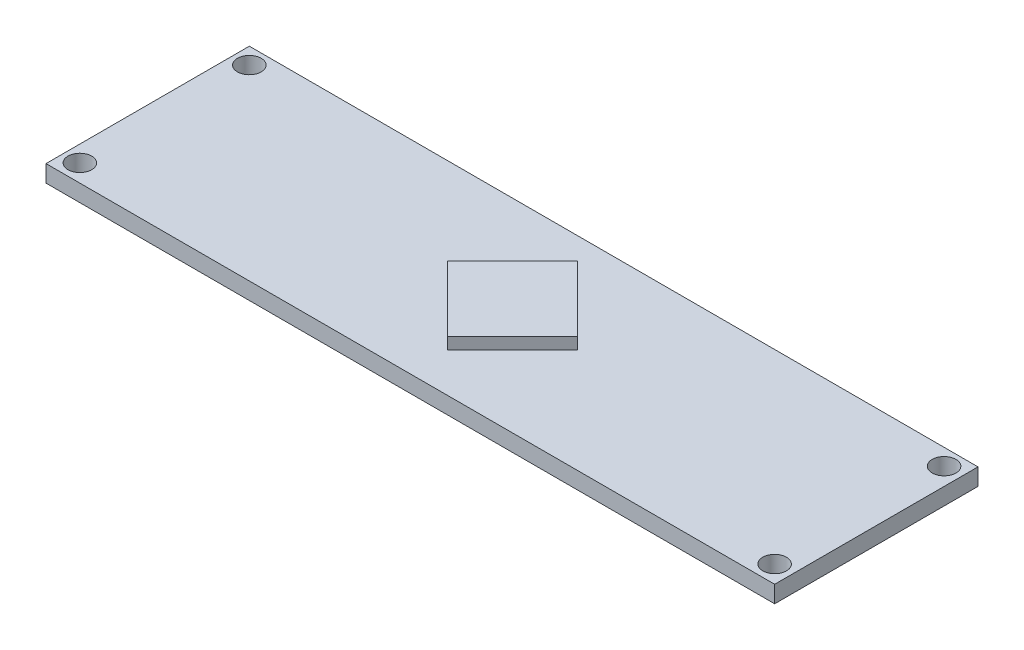
ISO-10303-21;
HEADER;
FILE_DESCRIPTION(('STEP AP214'),'2;1');
FILE_NAME('part.step','',(''),(''),'','','');
FILE_SCHEMA(('AUTOMOTIVE_DESIGN { 1 0 10303 214 1 1 1 1 }'));
ENDSEC;
DATA;
#1=APPLICATION_CONTEXT('core data for automotive mechanical design processes');
#2=APPLICATION_PROTOCOL_DEFINITION('international standard','automotive_design',2000,#1);
#3=PRODUCT_CONTEXT('',#1,'mechanical');
#4=PRODUCT('Part','Part','',(#3));
#5=PRODUCT_RELATED_PRODUCT_CATEGORY('part','',(#4));
#6=PRODUCT_DEFINITION_FORMATION('','',#4);
#7=PRODUCT_DEFINITION_CONTEXT('part definition',#1,'design');
#8=PRODUCT_DEFINITION('design','',#6,#7);
#9=PRODUCT_DEFINITION_SHAPE('','',#8);
#10=(LENGTH_UNIT() NAMED_UNIT(*) SI_UNIT(.MILLI.,.METRE.));
#11=(NAMED_UNIT(*) PLANE_ANGLE_UNIT() SI_UNIT($,.RADIAN.));
#12=(NAMED_UNIT(*) SI_UNIT($,.STERADIAN.) SOLID_ANGLE_UNIT());
#13=UNCERTAINTY_MEASURE_WITH_UNIT(LENGTH_MEASURE(1.E-05),#10,'distance_accuracy_value','');
#14=(GEOMETRIC_REPRESENTATION_CONTEXT(3) GLOBAL_UNCERTAINTY_ASSIGNED_CONTEXT((#13)) GLOBAL_UNIT_ASSIGNED_CONTEXT((#10,
#11,#12)) REPRESENTATION_CONTEXT('',''));
#15=CARTESIAN_POINT('',(0.,0.,0.));
#16=DIRECTION('',(0.,0.,1.));
#17=DIRECTION('',(1.,0.,0.));
#18=AXIS2_PLACEMENT_3D('',#15,#16,#17);
#19=CARTESIAN_POINT('',(0.,1.,0.));
#20=DIRECTION('',(0.,1.,0.));
#21=DIRECTION('',(0.,0.,1.));
#22=AXIS2_PLACEMENT_3D('',#19,#20,#21);
#23=PLANE('',#22);
#24=CARTESIAN_POINT('',(-20.5344248327645,1.,-5.03297406386491));
#25=DIRECTION('',(0.,1.,0.));
#26=DIRECTION('',(0.,0.,1.));
#27=AXIS2_PLACEMENT_3D('',#24,#25,#26);
#28=CIRCLE('',#27,0.699999999999998);
#29=CARTESIAN_POINT('',(-20.5344248327645,1.,-4.33297406386491));
#30=VERTEX_POINT('',#29);
#31=EDGE_CURVE('E135',#30,#30,#28,.T.);
#32=ORIENTED_EDGE('',*,*,#31,.F.);
#33=EDGE_LOOP('',(#32));
#34=FACE_BOUND('',#33,.T.);
#35=CARTESIAN_POINT('',(20.4655751672355,1.,4.96702593613509));
#36=DIRECTION('',(0.,1.,0.));
#37=DIRECTION('',(0.,0.,1.));
#38=AXIS2_PLACEMENT_3D('',#35,#36,#37);
#39=CIRCLE('',#38,0.699999999999998);
#40=CARTESIAN_POINT('',(20.4655751672355,1.,5.66702593613509));
#41=VERTEX_POINT('',#40);
#42=EDGE_CURVE('E149',#41,#41,#39,.T.);
#43=ORIENTED_EDGE('',*,*,#42,.F.);
#44=EDGE_LOOP('',(#43));
#45=FACE_BOUND('',#44,.T.);
#46=DIRECTION('',(0.,0.,1.));
#47=VECTOR('',#46,1.);
#48=CARTESIAN_POINT('',(-21.5,1.,-6.));
#49=LINE('',#48,#47);
#50=CARTESIAN_POINT('',(-21.5,1.,-6.));
#51=VERTEX_POINT('',#50);
#52=CARTESIAN_POINT('',(-21.5,1.,6.));
#53=VERTEX_POINT('',#52);
#54=EDGE_CURVE('E161',#51,#53,#49,.T.);
#55=ORIENTED_EDGE('',*,*,#54,.T.);
#56=DIRECTION('',(1.,0.,0.));
#57=VECTOR('',#56,1.);
#58=CARTESIAN_POINT('',(-21.5,1.,6.));
#59=LINE('',#58,#57);
#60=CARTESIAN_POINT('',(21.5,1.,5.99999999999999));
#61=VERTEX_POINT('',#60);
#62=EDGE_CURVE('E85',#53,#61,#59,.T.);
#63=ORIENTED_EDGE('',*,*,#62,.T.);
#64=DIRECTION('',(0.,0.,-1.));
#65=VECTOR('',#64,1.);
#66=CARTESIAN_POINT('',(21.5,1.,-6.00000000000001));
#67=LINE('',#66,#65);
#68=CARTESIAN_POINT('',(21.5,1.,-6.00000000000001));
#69=VERTEX_POINT('',#68);
#70=EDGE_CURVE('E164',#61,#69,#67,.T.);
#71=ORIENTED_EDGE('',*,*,#70,.T.);
#72=DIRECTION('',(-1.,0.,0.));
#73=VECTOR('',#72,1.);
#74=CARTESIAN_POINT('',(-21.5,1.,-6.));
#75=LINE('',#74,#73);
#76=EDGE_CURVE('E57',#69,#51,#75,.T.);
#77=ORIENTED_EDGE('',*,*,#76,.T.);
#78=EDGE_LOOP('',(#55,#63,#71,#77));
#79=FACE_BOUND('',#78,.T.);
#80=CARTESIAN_POINT('',(-20.5344248327645,1.,4.96702593613509));
#81=DIRECTION('',(0.,1.,0.));
#82=DIRECTION('',(0.,0.,1.));
#83=AXIS2_PLACEMENT_3D('',#80,#81,#82);
#84=CIRCLE('',#83,0.699999999999998);
#85=CARTESIAN_POINT('',(-20.5344248327645,1.,5.66702593613509));
#86=VERTEX_POINT('',#85);
#87=EDGE_CURVE('E155',#86,#86,#84,.T.);
#88=ORIENTED_EDGE('',*,*,#87,.F.);
#89=EDGE_LOOP('',(#88));
#90=FACE_BOUND('',#89,.T.);
#91=CARTESIAN_POINT('',(20.4655751672355,1.,-5.03297406386491));
#92=DIRECTION('',(0.,1.,0.));
#93=DIRECTION('',(0.,0.,1.));
#94=AXIS2_PLACEMENT_3D('',#91,#92,#93);
#95=CIRCLE('',#94,0.699999999999998);
#96=CARTESIAN_POINT('',(20.4655751672355,1.,-4.33297406386491));
#97=VERTEX_POINT('',#96);
#98=EDGE_CURVE('E143',#97,#97,#95,.T.);
#99=ORIENTED_EDGE('',*,*,#98,.F.);
#100=EDGE_LOOP('',(#99));
#101=FACE_BOUND('',#100,.T.);
#102=DIRECTION('',(0.707106781186546,0.,-0.707106781186549));
#103=VECTOR('',#102,1.);
#104=CARTESIAN_POINT('',(-0.13137989327656,1.,3.68965388034485));
#105=LINE('',#104,#103);
#106=CARTESIAN_POINT('',(-0.13137989327656,1.,3.68965388034485));
#107=VERTEX_POINT('',#106);
#108=CARTESIAN_POINT('',(3.718167830219,1.,-0.159893843150725));
#109=VERTEX_POINT('',#108);
#110=EDGE_CURVE('E332',#107,#109,#105,.T.);
#111=ORIENTED_EDGE('',*,*,#110,.F.);
#112=DIRECTION('',(0.707106781186549,0.,0.707106781186546));
#113=VECTOR('',#112,1.);
#114=CARTESIAN_POINT('',(-3.98092761677213,1.,-0.159893843150713));
#115=LINE('',#114,#113);
#116=CARTESIAN_POINT('',(-3.98092761677213,1.,-0.159893843150713));
#117=VERTEX_POINT('',#116);
#118=EDGE_CURVE('E130',#117,#107,#115,.T.);
#119=ORIENTED_EDGE('',*,*,#118,.F.);
#120=DIRECTION('',(-0.707106781186546,0.,0.707106781186549));
#121=VECTOR('',#120,1.);
#122=CARTESIAN_POINT('',(-3.98092761677213,1.,-0.159893843150713));
#123=LINE('',#122,#121);
#124=CARTESIAN_POINT('',(-0.131379893276574,1.,-4.00944156664628));
#125=VERTEX_POINT('',#124);
#126=EDGE_CURVE('E126',#125,#117,#123,.T.);
#127=ORIENTED_EDGE('',*,*,#126,.F.);
#128=DIRECTION('',(-0.707106781186549,0.,-0.707106781186546));
#129=VECTOR('',#128,1.);
#130=CARTESIAN_POINT('',(-0.131379893276574,1.,-4.00944156664629));
#131=LINE('',#130,#129);
#132=EDGE_CURVE('E329',#109,#125,#131,.T.);
#133=ORIENTED_EDGE('',*,*,#132,.F.);
#134=EDGE_LOOP('',(#111,#119,#127,#133));
#135=FACE_BOUND('',#134,.T.);
#136=ADVANCED_FACE('F33',(#34,#45,#79,#90,#101,#135),#23,.T.);
#137=CARTESIAN_POINT('',(0.,0.,0.));
#138=DIRECTION('',(0.,1.,0.));
#139=DIRECTION('',(0.,0.,1.));
#140=AXIS2_PLACEMENT_3D('',#137,#138,#139);
#141=PLANE('',#140);
#142=CARTESIAN_POINT('',(20.4655751672355,0.,-5.03297406386491));
#143=DIRECTION('',(0.,1.,0.));
#144=DIRECTION('',(0.,0.,1.));
#145=AXIS2_PLACEMENT_3D('',#142,#143,#144);
#146=CIRCLE('',#145,0.699999999999998);
#147=CARTESIAN_POINT('',(20.4655751672355,0.,-4.33297406386491));
#148=VERTEX_POINT('',#147);
#149=EDGE_CURVE('E141',#148,#148,#146,.T.);
#150=ORIENTED_EDGE('',*,*,#149,.T.);
#151=EDGE_LOOP('',(#150));
#152=FACE_BOUND('',#151,.T.);
#153=CARTESIAN_POINT('',(-20.5344248327645,0.,4.96702593613509));
#154=DIRECTION('',(0.,1.,0.));
#155=DIRECTION('',(0.,0.,1.));
#156=AXIS2_PLACEMENT_3D('',#153,#154,#155);
#157=CIRCLE('',#156,0.699999999999998);
#158=CARTESIAN_POINT('',(-20.5344248327645,0.,5.66702593613509));
#159=VERTEX_POINT('',#158);
#160=EDGE_CURVE('E152',#159,#159,#157,.T.);
#161=ORIENTED_EDGE('',*,*,#160,.T.);
#162=EDGE_LOOP('',(#161));
#163=FACE_BOUND('',#162,.T.);
#164=DIRECTION('',(0.,0.,1.));
#165=VECTOR('',#164,1.);
#166=CARTESIAN_POINT('',(-21.5,0.,-6.));
#167=LINE('',#166,#165);
#168=CARTESIAN_POINT('',(-21.5,0.,-6.));
#169=VERTEX_POINT('',#168);
#170=CARTESIAN_POINT('',(-21.5,0.,6.));
#171=VERTEX_POINT('',#170);
#172=EDGE_CURVE('E158',#169,#171,#167,.T.);
#173=ORIENTED_EDGE('',*,*,#172,.F.);
#174=DIRECTION('',(-1.,0.,0.));
#175=VECTOR('',#174,1.);
#176=CARTESIAN_POINT('',(-21.5,0.,-6.));
#177=LINE('',#176,#175);
#178=CARTESIAN_POINT('',(21.5,0.,-6.00000000000001));
#179=VERTEX_POINT('',#178);
#180=EDGE_CURVE('E78',#179,#169,#177,.T.);
#181=ORIENTED_EDGE('',*,*,#180,.F.);
#182=DIRECTION('',(0.,0.,-1.));
#183=VECTOR('',#182,1.);
#184=CARTESIAN_POINT('',(21.5,0.,-6.00000000000001));
#185=LINE('',#184,#183);
#186=CARTESIAN_POINT('',(21.5,0.,5.99999999999999));
#187=VERTEX_POINT('',#186);
#188=EDGE_CURVE('E172',#187,#179,#185,.T.);
#189=ORIENTED_EDGE('',*,*,#188,.F.);
#190=DIRECTION('',(1.,0.,0.));
#191=VECTOR('',#190,1.);
#192=CARTESIAN_POINT('',(-21.5,0.,6.));
#193=LINE('',#192,#191);
#194=EDGE_CURVE('E170',#171,#187,#193,.T.);
#195=ORIENTED_EDGE('',*,*,#194,.F.);
#196=EDGE_LOOP('',(#173,#181,#189,#195));
#197=FACE_BOUND('',#196,.T.);
#198=CARTESIAN_POINT('',(20.4655751672355,0.,4.96702593613509));
#199=DIRECTION('',(0.,1.,0.));
#200=DIRECTION('',(0.,0.,1.));
#201=AXIS2_PLACEMENT_3D('',#198,#199,#200);
#202=CIRCLE('',#201,0.699999999999998);
#203=CARTESIAN_POINT('',(20.4655751672355,0.,5.66702593613509));
#204=VERTEX_POINT('',#203);
#205=EDGE_CURVE('E146',#204,#204,#202,.T.);
#206=ORIENTED_EDGE('',*,*,#205,.T.);
#207=EDGE_LOOP('',(#206));
#208=FACE_BOUND('',#207,.T.);
#209=CARTESIAN_POINT('',(-20.5344248327645,0.,-5.03297406386491));
#210=DIRECTION('',(0.,1.,0.));
#211=DIRECTION('',(0.,0.,1.));
#212=AXIS2_PLACEMENT_3D('',#209,#210,#211);
#213=CIRCLE('',#212,0.699999999999998);
#214=CARTESIAN_POINT('',(-20.5344248327645,0.,-4.33297406386491));
#215=VERTEX_POINT('',#214);
#216=EDGE_CURVE('E132',#215,#215,#213,.T.);
#217=ORIENTED_EDGE('',*,*,#216,.T.);
#218=EDGE_LOOP('',(#217));
#219=FACE_BOUND('',#218,.T.);
#220=ADVANCED_FACE('F185',(#152,#163,#197,#208,#219),#141,.F.);
#221=CARTESIAN_POINT('',(-21.5,1.,-6.));
#222=DIRECTION('',(1.,0.,0.));
#223=DIRECTION('',(0.,0.,-1.));
#224=AXIS2_PLACEMENT_3D('',#221,#222,#223);
#225=PLANE('',#224);
#226=ORIENTED_EDGE('',*,*,#172,.T.);
#227=DIRECTION('',(0.,-1.,0.));
#228=VECTOR('',#227,1.);
#229=CARTESIAN_POINT('',(-21.5,1.,6.));
#230=LINE('',#229,#228);
#231=EDGE_CURVE('E11',#53,#171,#230,.T.);
#232=ORIENTED_EDGE('',*,*,#231,.F.);
#233=ORIENTED_EDGE('',*,*,#54,.F.);
#234=DIRECTION('',(0.,-1.,0.));
#235=VECTOR('',#234,1.);
#236=CARTESIAN_POINT('',(-21.5,1.,-6.));
#237=LINE('',#236,#235);
#238=EDGE_CURVE('E167',#51,#169,#237,.T.);
#239=ORIENTED_EDGE('',*,*,#238,.T.);
#240=EDGE_LOOP('',(#226,#232,#233,#239));
#241=FACE_BOUND('',#240,.T.);
#242=ADVANCED_FACE('F35',(#241),#225,.F.);
#243=CARTESIAN_POINT('',(-21.5,1.,6.));
#244=DIRECTION('',(0.,0.,-1.));
#245=DIRECTION('',(-1.,0.,0.));
#246=AXIS2_PLACEMENT_3D('',#243,#244,#245);
#247=PLANE('',#246);
#248=ORIENTED_EDGE('',*,*,#194,.T.);
#249=DIRECTION('',(0.,-1.,0.));
#250=VECTOR('',#249,1.);
#251=CARTESIAN_POINT('',(21.5,1.,5.99999999999999));
#252=LINE('',#251,#250);
#253=EDGE_CURVE('E41',#61,#187,#252,.T.);
#254=ORIENTED_EDGE('',*,*,#253,.F.);
#255=ORIENTED_EDGE('',*,*,#62,.F.);
#256=ORIENTED_EDGE('',*,*,#231,.T.);
#257=EDGE_LOOP('',(#248,#254,#255,#256));
#258=FACE_BOUND('',#257,.T.);
#259=ADVANCED_FACE('F201',(#258),#247,.F.);
#260=CARTESIAN_POINT('',(21.5,1.,-6.00000000000001));
#261=DIRECTION('',(-1.,0.,0.));
#262=DIRECTION('',(0.,0.,1.));
#263=AXIS2_PLACEMENT_3D('',#260,#261,#262);
#264=PLANE('',#263);
#265=ORIENTED_EDGE('',*,*,#188,.T.);
#266=DIRECTION('',(0.,-1.,0.));
#267=VECTOR('',#266,1.);
#268=CARTESIAN_POINT('',(21.5,1.,-6.00000000000001));
#269=LINE('',#268,#267);
#270=EDGE_CURVE('E176',#69,#179,#269,.T.);
#271=ORIENTED_EDGE('',*,*,#270,.F.);
#272=ORIENTED_EDGE('',*,*,#70,.F.);
#273=ORIENTED_EDGE('',*,*,#253,.T.);
#274=EDGE_LOOP('',(#265,#271,#272,#273));
#275=FACE_BOUND('',#274,.T.);
#276=ADVANCED_FACE('F181',(#275),#264,.F.);
#277=CARTESIAN_POINT('',(-21.5,1.,-6.));
#278=DIRECTION('',(0.,0.,1.));
#279=DIRECTION('',(1.,0.,0.));
#280=AXIS2_PLACEMENT_3D('',#277,#278,#279);
#281=PLANE('',#280);
#282=ORIENTED_EDGE('',*,*,#180,.T.);
#283=ORIENTED_EDGE('',*,*,#238,.F.);
#284=ORIENTED_EDGE('',*,*,#76,.F.);
#285=ORIENTED_EDGE('',*,*,#270,.T.);
#286=EDGE_LOOP('',(#282,#283,#284,#285));
#287=FACE_BOUND('',#286,.T.);
#288=ADVANCED_FACE('F190',(#287),#281,.F.);
#289=CARTESIAN_POINT('',(-20.5344248327645,1.,4.96702593613509));
#290=DIRECTION('',(0.,-1.,0.));
#291=DIRECTION('',(0.,0.,-1.));
#292=AXIS2_PLACEMENT_3D('',#289,#290,#291);
#293=CYLINDRICAL_SURFACE('',#292,0.699999999999998);
#294=ORIENTED_EDGE('',*,*,#87,.T.);
#295=EDGE_LOOP('',(#294));
#296=FACE_BOUND('',#295,.T.);
#297=ORIENTED_EDGE('',*,*,#160,.F.);
#298=EDGE_LOOP('',(#297));
#299=FACE_BOUND('',#298,.T.);
#300=ADVANCED_FACE('F192',(#296,#299),#293,.F.);
#301=CARTESIAN_POINT('',(20.4655751672355,1.,4.96702593613509));
#302=DIRECTION('',(0.,-1.,0.));
#303=DIRECTION('',(0.,0.,-1.));
#304=AXIS2_PLACEMENT_3D('',#301,#302,#303);
#305=CYLINDRICAL_SURFACE('',#304,0.699999999999998);
#306=ORIENTED_EDGE('',*,*,#42,.T.);
#307=EDGE_LOOP('',(#306));
#308=FACE_BOUND('',#307,.T.);
#309=ORIENTED_EDGE('',*,*,#205,.F.);
#310=EDGE_LOOP('',(#309));
#311=FACE_BOUND('',#310,.T.);
#312=ADVANCED_FACE('F198',(#308,#311),#305,.F.);
#313=CARTESIAN_POINT('',(20.4655751672355,1.,-5.03297406386491));
#314=DIRECTION('',(0.,-1.,0.));
#315=DIRECTION('',(0.,0.,-1.));
#316=AXIS2_PLACEMENT_3D('',#313,#314,#315);
#317=CYLINDRICAL_SURFACE('',#316,0.699999999999998);
#318=ORIENTED_EDGE('',*,*,#98,.T.);
#319=EDGE_LOOP('',(#318));
#320=FACE_BOUND('',#319,.T.);
#321=ORIENTED_EDGE('',*,*,#149,.F.);
#322=EDGE_LOOP('',(#321));
#323=FACE_BOUND('',#322,.T.);
#324=ADVANCED_FACE('F218',(#320,#323),#317,.F.);
#325=CARTESIAN_POINT('',(-20.5344248327645,1.,-5.03297406386491));
#326=DIRECTION('',(0.,-1.,0.));
#327=DIRECTION('',(0.,0.,-1.));
#328=AXIS2_PLACEMENT_3D('',#325,#326,#327);
#329=CYLINDRICAL_SURFACE('',#328,0.699999999999998);
#330=ORIENTED_EDGE('',*,*,#31,.T.);
#331=EDGE_LOOP('',(#330));
#332=FACE_BOUND('',#331,.T.);
#333=ORIENTED_EDGE('',*,*,#216,.F.);
#334=EDGE_LOOP('',(#333));
#335=FACE_BOUND('',#334,.T.);
#336=ADVANCED_FACE('F222',(#332,#335),#329,.F.);
#337=CARTESIAN_POINT('',(-3.98092761677213,1.7,-0.159893843150713));
#338=DIRECTION('',(0.707106781186546,0.,-0.707106781186549));
#339=DIRECTION('',(-0.707106781186549,0.,-0.707106781186546));
#340=AXIS2_PLACEMENT_3D('',#337,#338,#339);
#341=PLANE('',#340);
#342=ORIENTED_EDGE('',*,*,#118,.T.);
#343=DIRECTION('',(0.,-1.,0.));
#344=VECTOR('',#343,1.);
#345=CARTESIAN_POINT('',(-0.13137989327656,1.7,3.68965388034485));
#346=LINE('',#345,#344);
#347=CARTESIAN_POINT('',(-0.13137989327656,1.7,3.68965388034485));
#348=VERTEX_POINT('',#347);
#349=EDGE_CURVE('E111',#348,#107,#346,.T.);
#350=ORIENTED_EDGE('',*,*,#349,.F.);
#351=DIRECTION('',(0.707106781186549,0.,0.707106781186546));
#352=VECTOR('',#351,1.);
#353=CARTESIAN_POINT('',(-3.98092761677213,1.7,-0.159893843150713));
#354=LINE('',#353,#352);
#355=CARTESIAN_POINT('',(-3.98092761677213,1.7,-0.159893843150713));
#356=VERTEX_POINT('',#355);
#357=EDGE_CURVE('E118',#356,#348,#354,.T.);
#358=ORIENTED_EDGE('',*,*,#357,.F.);
#359=DIRECTION('',(0.,-1.,0.));
#360=VECTOR('',#359,1.);
#361=CARTESIAN_POINT('',(-3.98092761677213,1.7,-0.159893843150713));
#362=LINE('',#361,#360);
#363=EDGE_CURVE('E326',#356,#117,#362,.T.);
#364=ORIENTED_EDGE('',*,*,#363,.T.);
#365=EDGE_LOOP('',(#342,#350,#358,#364));
#366=FACE_BOUND('',#365,.T.);
#367=ADVANCED_FACE('F128',(#366),#341,.F.);
#368=CARTESIAN_POINT('',(-0.13137989327656,1.7,3.68965388034485));
#369=DIRECTION('',(-0.707106781186549,0.,-0.707106781186546));
#370=DIRECTION('',(-0.707106781186546,0.,0.707106781186549));
#371=AXIS2_PLACEMENT_3D('',#368,#369,#370);
#372=PLANE('',#371);
#373=ORIENTED_EDGE('',*,*,#110,.T.);
#374=DIRECTION('',(0.,-1.,0.));
#375=VECTOR('',#374,1.);
#376=CARTESIAN_POINT('',(3.718167830219,1.7,-0.159893843150725));
#377=LINE('',#376,#375);
#378=CARTESIAN_POINT('',(3.718167830219,1.7,-0.159893843150725));
#379=VERTEX_POINT('',#378);
#380=EDGE_CURVE('E114',#379,#109,#377,.T.);
#381=ORIENTED_EDGE('',*,*,#380,.F.);
#382=DIRECTION('',(0.707106781186546,0.,-0.707106781186549));
#383=VECTOR('',#382,1.);
#384=CARTESIAN_POINT('',(-0.13137989327656,1.7,3.68965388034485));
#385=LINE('',#384,#383);
#386=EDGE_CURVE('E107',#348,#379,#385,.T.);
#387=ORIENTED_EDGE('',*,*,#386,.F.);
#388=ORIENTED_EDGE('',*,*,#349,.T.);
#389=EDGE_LOOP('',(#373,#381,#387,#388));
#390=FACE_BOUND('',#389,.T.);
#391=ADVANCED_FACE('F109',(#390),#372,.F.);
#392=CARTESIAN_POINT('',(-0.131379893276574,1.7,-4.00944156664629));
#393=DIRECTION('',(-0.707106781186546,0.,0.707106781186549));
#394=DIRECTION('',(0.707106781186549,0.,0.707106781186546));
#395=AXIS2_PLACEMENT_3D('',#392,#393,#394);
#396=PLANE('',#395);
#397=ORIENTED_EDGE('',*,*,#132,.T.);
#398=DIRECTION('',(0.,-1.,0.));
#399=VECTOR('',#398,1.);
#400=CARTESIAN_POINT('',(-0.131379893276574,1.7,-4.00944156664629));
#401=LINE('',#400,#399);
#402=CARTESIAN_POINT('',(-0.131379893276574,1.7,-4.00944156664629));
#403=VERTEX_POINT('',#402);
#404=EDGE_CURVE('E48',#403,#125,#401,.T.);
#405=ORIENTED_EDGE('',*,*,#404,.F.);
#406=DIRECTION('',(-0.707106781186549,0.,-0.707106781186546));
#407=VECTOR('',#406,1.);
#408=CARTESIAN_POINT('',(-0.131379893276574,1.7,-4.00944156664629));
#409=LINE('',#408,#407);
#410=EDGE_CURVE('E117',#379,#403,#409,.T.);
#411=ORIENTED_EDGE('',*,*,#410,.F.);
#412=ORIENTED_EDGE('',*,*,#380,.T.);
#413=EDGE_LOOP('',(#397,#405,#411,#412));
#414=FACE_BOUND('',#413,.T.);
#415=ADVANCED_FACE('F231',(#414),#396,.F.);
#416=CARTESIAN_POINT('',(-3.98092761677213,1.7,-0.159893843150713));
#417=DIRECTION('',(0.707106781186549,0.,0.707106781186546));
#418=DIRECTION('',(0.707106781186546,0.,-0.707106781186549));
#419=AXIS2_PLACEMENT_3D('',#416,#417,#418);
#420=PLANE('',#419);
#421=ORIENTED_EDGE('',*,*,#126,.T.);
#422=ORIENTED_EDGE('',*,*,#363,.F.);
#423=DIRECTION('',(-0.707106781186546,0.,0.707106781186549));
#424=VECTOR('',#423,1.);
#425=CARTESIAN_POINT('',(-3.98092761677213,1.7,-0.159893843150713));
#426=LINE('',#425,#424);
#427=EDGE_CURVE('E122',#403,#356,#426,.T.);
#428=ORIENTED_EDGE('',*,*,#427,.F.);
#429=ORIENTED_EDGE('',*,*,#404,.T.);
#430=EDGE_LOOP('',(#421,#422,#428,#429));
#431=FACE_BOUND('',#430,.T.);
#432=ADVANCED_FACE('F234',(#431),#420,.F.);
#433=CARTESIAN_POINT('',(0.,1.7,0.));
#434=DIRECTION('',(0.,1.,0.));
#435=DIRECTION('',(0.,0.,1.));
#436=AXIS2_PLACEMENT_3D('',#433,#434,#435);
#437=PLANE('',#436);
#438=ORIENTED_EDGE('',*,*,#357,.T.);
#439=ORIENTED_EDGE('',*,*,#386,.T.);
#440=ORIENTED_EDGE('',*,*,#410,.T.);
#441=ORIENTED_EDGE('',*,*,#427,.T.);
#442=EDGE_LOOP('',(#438,#439,#440,#441));
#443=FACE_BOUND('',#442,.T.);
#444=ADVANCED_FACE('F121',(#443),#437,.T.);
#445=CLOSED_SHELL('',(#136,#220,#242,#259,#276,#288,#300,#312,#324,#336,#367,#391,#415,#432,#444));
#446=MANIFOLD_SOLID_BREP('B2',#445);
#447=ADVANCED_BREP_SHAPE_REPRESENTATION('',(#18,#446),#14);
#448=SHAPE_DEFINITION_REPRESENTATION(#9,#447);
ENDSEC;
END-ISO-10303-21;
